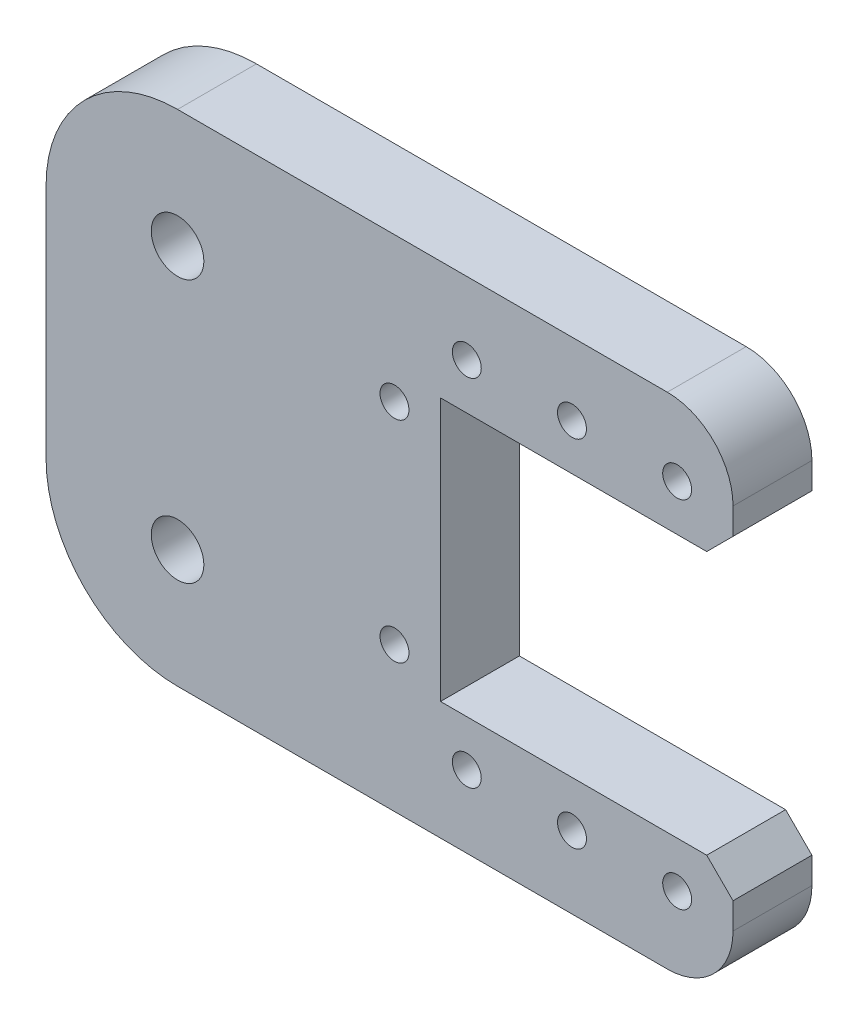
ISO-10303-21;
HEADER;
FILE_DESCRIPTION(('STEP AP214'),'2;1');
FILE_NAME('part.step','',(''),(''),'','','');
FILE_SCHEMA(('AUTOMOTIVE_DESIGN { 1 0 10303 214 1 1 1 1 }'));
ENDSEC;
DATA;
#1=APPLICATION_CONTEXT('core data for automotive mechanical design processes');
#2=APPLICATION_PROTOCOL_DEFINITION('international standard','automotive_design',2000,#1);
#3=PRODUCT_CONTEXT('',#1,'mechanical');
#4=PRODUCT('Part','Part','',(#3));
#5=PRODUCT_RELATED_PRODUCT_CATEGORY('part','',(#4));
#6=PRODUCT_DEFINITION_FORMATION('','',#4);
#7=PRODUCT_DEFINITION_CONTEXT('part definition',#1,'design');
#8=PRODUCT_DEFINITION('design','',#6,#7);
#9=PRODUCT_DEFINITION_SHAPE('','',#8);
#10=(LENGTH_UNIT() NAMED_UNIT(*) SI_UNIT(.MILLI.,.METRE.));
#11=(NAMED_UNIT(*) PLANE_ANGLE_UNIT() SI_UNIT($,.RADIAN.));
#12=(NAMED_UNIT(*) SI_UNIT($,.STERADIAN.) SOLID_ANGLE_UNIT());
#13=UNCERTAINTY_MEASURE_WITH_UNIT(LENGTH_MEASURE(1.E-05),#10,'distance_accuracy_value','');
#14=(GEOMETRIC_REPRESENTATION_CONTEXT(3) GLOBAL_UNCERTAINTY_ASSIGNED_CONTEXT((#13)) GLOBAL_UNIT_ASSIGNED_CONTEXT((#10,
#11,#12)) REPRESENTATION_CONTEXT('',''));
#15=CARTESIAN_POINT('',(0.,0.,0.));
#16=DIRECTION('',(0.,0.,1.));
#17=DIRECTION('',(1.,0.,0.));
#18=AXIS2_PLACEMENT_3D('',#15,#16,#17);
#19=CARTESIAN_POINT('',(0.,0.,6.));
#20=DIRECTION('',(0.,0.,1.));
#21=DIRECTION('',(1.,0.,0.));
#22=AXIS2_PLACEMENT_3D('',#19,#20,#21);
#23=PLANE('',#22);
#24=CARTESIAN_POINT('',(11.9181455910028,-23.3165283540876,6.));
#25=DIRECTION('',(0.,0.,1.));
#26=DIRECTION('',(1.,0.,0.));
#27=AXIS2_PLACEMENT_3D('',#24,#25,#26);
#28=CIRCLE('',#27,1.10000000000211);
#29=CARTESIAN_POINT('',(13.018145591005,-23.3165283540876,6.));
#30=VERTEX_POINT('',#29);
#31=EDGE_CURVE('E507',#30,#30,#28,.T.);
#32=ORIENTED_EDGE('',*,*,#31,.F.);
#33=EDGE_LOOP('',(#32));
#34=FACE_BOUND('',#33,.T.);
#35=CARTESIAN_POINT('',(3.91814559100285,-23.3165283540876,6.));
#36=DIRECTION('',(0.,0.,1.));
#37=DIRECTION('',(1.,0.,0.));
#38=AXIS2_PLACEMENT_3D('',#35,#36,#37);
#39=CIRCLE('',#38,1.1000000000047);
#40=CARTESIAN_POINT('',(5.01814559100755,-23.3165283540876,6.));
#41=VERTEX_POINT('',#40);
#42=EDGE_CURVE('E501',#41,#41,#39,.T.);
#43=ORIENTED_EDGE('',*,*,#42,.F.);
#44=EDGE_LOOP('',(#43));
#45=FACE_BOUND('',#44,.T.);
#46=CARTESIAN_POINT('',(-4.08185440899716,-23.3165283540875,6.));
#47=DIRECTION('',(0.,0.,1.));
#48=DIRECTION('',(1.,0.,0.));
#49=AXIS2_PLACEMENT_3D('',#46,#47,#48);
#50=CIRCLE('',#49,1.1000000000047);
#51=CARTESIAN_POINT('',(-2.98185440899245,-23.3165283540875,6.));
#52=VERTEX_POINT('',#51);
#53=EDGE_CURVE('E495',#52,#52,#50,.T.);
#54=ORIENTED_EDGE('',*,*,#53,.F.);
#55=EDGE_LOOP('',(#54));
#56=FACE_BOUND('',#55,.T.);
#57=CARTESIAN_POINT('',(-9.58185440899689,-17.8165283540763,6.));
#58=DIRECTION('',(0.,0.,1.));
#59=DIRECTION('',(1.,0.,0.));
#60=AXIS2_PLACEMENT_3D('',#57,#58,#59);
#61=CIRCLE('',#60,1.09999999999961);
#62=CARTESIAN_POINT('',(-8.48185440899728,-17.8165283540763,6.));
#63=VERTEX_POINT('',#62);
#64=EDGE_CURVE('E489',#63,#63,#61,.T.);
#65=ORIENTED_EDGE('',*,*,#64,.F.);
#66=EDGE_LOOP('',(#65));
#67=FACE_BOUND('',#66,.T.);
#68=CARTESIAN_POINT('',(-9.58185440899688,-1.81652835408409,6.));
#69=DIRECTION('',(0.,0.,1.));
#70=DIRECTION('',(1.,0.,0.));
#71=AXIS2_PLACEMENT_3D('',#68,#69,#70);
#72=CIRCLE('',#71,1.09999999999961);
#73=CARTESIAN_POINT('',(-8.48185440899727,-1.81652835408409,6.));
#74=VERTEX_POINT('',#73);
#75=EDGE_CURVE('E483',#74,#74,#72,.T.);
#76=ORIENTED_EDGE('',*,*,#75,.F.);
#77=EDGE_LOOP('',(#76));
#78=FACE_BOUND('',#77,.T.);
#79=CARTESIAN_POINT('',(11.9181455910028,3.68347164592715,6.));
#80=DIRECTION('',(0.,0.,1.));
#81=DIRECTION('',(1.,0.,0.));
#82=AXIS2_PLACEMENT_3D('',#79,#80,#81);
#83=CIRCLE('',#82,1.1000000000047);
#84=CARTESIAN_POINT('',(13.0181455910075,3.68347164592715,6.));
#85=VERTEX_POINT('',#84);
#86=EDGE_CURVE('E477',#85,#85,#83,.T.);
#87=ORIENTED_EDGE('',*,*,#86,.F.);
#88=EDGE_LOOP('',(#87));
#89=FACE_BOUND('',#88,.T.);
#90=CARTESIAN_POINT('',(3.91814559100278,3.68347164592722,6.));
#91=DIRECTION('',(0.,0.,1.));
#92=DIRECTION('',(1.,0.,0.));
#93=AXIS2_PLACEMENT_3D('',#90,#91,#92);
#94=CIRCLE('',#93,1.10000000000475);
#95=CARTESIAN_POINT('',(5.01814559100752,3.68347164592722,6.));
#96=VERTEX_POINT('',#95);
#97=EDGE_CURVE('E471',#96,#96,#94,.T.);
#98=ORIENTED_EDGE('',*,*,#97,.F.);
#99=EDGE_LOOP('',(#98));
#100=FACE_BOUND('',#99,.T.);
#101=CARTESIAN_POINT('',(-4.08185440899722,3.68347164592721,6.));
#102=DIRECTION('',(0.,0.,1.));
#103=DIRECTION('',(1.,0.,0.));
#104=AXIS2_PLACEMENT_3D('',#101,#102,#103);
#105=CIRCLE('',#104,1.10000000000216);
#106=CARTESIAN_POINT('',(-2.98185440899506,3.68347164592721,6.));
#107=VERTEX_POINT('',#106);
#108=EDGE_CURVE('E458',#107,#107,#105,.T.);
#109=ORIENTED_EDGE('',*,*,#108,.F.);
#110=EDGE_LOOP('',(#109));
#111=FACE_BOUND('',#110,.T.);
#112=CARTESIAN_POINT('',(-26.0818544089971,0.18347164591978,6.));
#113=DIRECTION('',(0.,0.,1.));
#114=DIRECTION('',(1.,0.,0.));
#115=AXIS2_PLACEMENT_3D('',#112,#113,#114);
#116=CIRCLE('',#115,2.);
#117=CARTESIAN_POINT('',(-24.0818544089971,0.18347164591978,6.));
#118=VERTEX_POINT('',#117);
#119=EDGE_CURVE('E168',#118,#118,#116,.T.);
#120=ORIENTED_EDGE('',*,*,#119,.F.);
#121=EDGE_LOOP('',(#120));
#122=FACE_BOUND('',#121,.T.);
#123=DIRECTION('',(0.,1.,0.));
#124=VECTOR('',#123,1.);
#125=CARTESIAN_POINT('',(16.1681455910029,-28.8165283540802,6.));
#126=LINE('',#125,#124);
#127=CARTESIAN_POINT('',(16.1681455910029,-23.8165283540802,6.));
#128=VERTEX_POINT('',#127);
#129=CARTESIAN_POINT('',(16.1681455910029,-21.8165283540802,6.));
#130=VERTEX_POINT('',#129);
#131=EDGE_CURVE('E144',#128,#130,#126,.T.);
#132=ORIENTED_EDGE('',*,*,#131,.T.);
#133=DIRECTION('',(0.707106781186546,-0.707106781186549,0.));
#134=VECTOR('',#133,1.);
#135=CARTESIAN_POINT('',(-2.82419138153864,-2.82419138153863,6.));
#136=LINE('',#135,#134);
#137=CARTESIAN_POINT('',(14.1681455910029,-19.8165283540802,6.));
#138=VERTEX_POINT('',#137);
#139=EDGE_CURVE('E140',#130,#138,#136,.F.);
#140=ORIENTED_EDGE('',*,*,#139,.T.);
#141=DIRECTION('',(-1.,0.,0.));
#142=VECTOR('',#141,1.);
#143=CARTESIAN_POINT('',(16.1681455910029,-19.8165283540802,6.));
#144=LINE('',#143,#142);
#145=CARTESIAN_POINT('',(-6.08185440899712,-19.8165283540802,6.));
#146=VERTEX_POINT('',#145);
#147=EDGE_CURVE('E132',#138,#146,#144,.T.);
#148=ORIENTED_EDGE('',*,*,#147,.T.);
#149=DIRECTION('',(0.,1.,0.));
#150=VECTOR('',#149,1.);
#151=CARTESIAN_POINT('',(-6.08185440899712,-19.8165283540802,6.));
#152=LINE('',#151,#150);
#153=CARTESIAN_POINT('',(-6.08185440899712,0.18347164591978,6.));
#154=VERTEX_POINT('',#153);
#155=EDGE_CURVE('E137',#146,#154,#152,.T.);
#156=ORIENTED_EDGE('',*,*,#155,.T.);
#157=DIRECTION('',(1.,0.,0.));
#158=VECTOR('',#157,1.);
#159=CARTESIAN_POINT('',(-6.08185440899712,0.18347164591978,6.));
#160=LINE('',#159,#158);
#161=CARTESIAN_POINT('',(14.1681455910029,0.18347164591978,6.));
#162=VERTEX_POINT('',#161);
#163=EDGE_CURVE('E158',#154,#162,#160,.T.);
#164=ORIENTED_EDGE('',*,*,#163,.T.);
#165=DIRECTION('',(-0.707106781186549,-0.707106781186546,0.));
#166=VECTOR('',#165,1.);
#167=CARTESIAN_POINT('',(6.99233697254152,-6.99233697254155,6.));
#168=LINE('',#167,#166);
#169=CARTESIAN_POINT('',(16.1681455910029,2.18347164591977,6.));
#170=VERTEX_POINT('',#169);
#171=EDGE_CURVE('E48',#162,#170,#168,.F.);
#172=ORIENTED_EDGE('',*,*,#171,.T.);
#173=DIRECTION('',(0.,1.,0.));
#174=VECTOR('',#173,1.);
#175=CARTESIAN_POINT('',(16.1681455910029,0.18347164591978,6.));
#176=LINE('',#175,#174);
#177=CARTESIAN_POINT('',(16.1681455910029,4.18347164591978,6.));
#178=VERTEX_POINT('',#177);
#179=EDGE_CURVE('E160',#170,#178,#176,.T.);
#180=ORIENTED_EDGE('',*,*,#179,.T.);
#181=CARTESIAN_POINT('',(11.1681455910029,4.18347164591978,6.));
#182=DIRECTION('',(0.,0.,1.));
#183=DIRECTION('',(1.,0.,0.));
#184=AXIS2_PLACEMENT_3D('',#181,#182,#183);
#185=CIRCLE('',#184,5.);
#186=CARTESIAN_POINT('',(11.1681455910029,9.18347164591978,6.));
#187=VERTEX_POINT('',#186);
#188=EDGE_CURVE('E215',#178,#187,#185,.T.);
#189=ORIENTED_EDGE('',*,*,#188,.T.);
#190=DIRECTION('',(-1.,0.,0.));
#191=VECTOR('',#190,1.);
#192=CARTESIAN_POINT('',(16.1681455910029,9.18347164591978,6.));
#193=LINE('',#192,#191);
#194=CARTESIAN_POINT('',(-26.0818544089971,9.18347164591978,6.));
#195=VERTEX_POINT('',#194);
#196=EDGE_CURVE('E184',#187,#195,#193,.T.);
#197=ORIENTED_EDGE('',*,*,#196,.T.);
#198=CARTESIAN_POINT('',(-26.0818544089971,-0.816528354080226,6.));
#199=DIRECTION('',(0.,0.,1.));
#200=DIRECTION('',(1.,0.,0.));
#201=AXIS2_PLACEMENT_3D('',#198,#199,#200);
#202=CIRCLE('',#201,10.);
#203=CARTESIAN_POINT('',(-36.0818544089971,-0.816528354080227,6.));
#204=VERTEX_POINT('',#203);
#205=EDGE_CURVE('E198',#195,#204,#202,.T.);
#206=ORIENTED_EDGE('',*,*,#205,.T.);
#207=DIRECTION('',(0.,-1.,0.));
#208=VECTOR('',#207,1.);
#209=CARTESIAN_POINT('',(-36.0818544089971,9.18347164591977,6.));
#210=LINE('',#209,#208);
#211=CARTESIAN_POINT('',(-36.0818544089971,-18.8165283540802,6.));
#212=VERTEX_POINT('',#211);
#213=EDGE_CURVE('E255',#204,#212,#210,.T.);
#214=ORIENTED_EDGE('',*,*,#213,.T.);
#215=CARTESIAN_POINT('',(-26.0818544089971,-18.8165283540802,6.));
#216=DIRECTION('',(0.,0.,1.));
#217=DIRECTION('',(1.,0.,0.));
#218=AXIS2_PLACEMENT_3D('',#215,#216,#217);
#219=CIRCLE('',#218,10.);
#220=CARTESIAN_POINT('',(-26.0818544089971,-28.8165283540802,6.));
#221=VERTEX_POINT('',#220);
#222=EDGE_CURVE('E200',#212,#221,#219,.T.);
#223=ORIENTED_EDGE('',*,*,#222,.T.);
#224=DIRECTION('',(1.,0.,0.));
#225=VECTOR('',#224,1.);
#226=CARTESIAN_POINT('',(-36.0818544089971,-28.8165283540802,6.));
#227=LINE('',#226,#225);
#228=CARTESIAN_POINT('',(11.1681455910029,-28.8165283540802,6.));
#229=VERTEX_POINT('',#228);
#230=EDGE_CURVE('E258',#221,#229,#227,.T.);
#231=ORIENTED_EDGE('',*,*,#230,.T.);
#232=CARTESIAN_POINT('',(11.1681455910029,-23.8165283540802,6.));
#233=DIRECTION('',(0.,0.,1.));
#234=DIRECTION('',(1.,0.,0.));
#235=AXIS2_PLACEMENT_3D('',#232,#233,#234);
#236=CIRCLE('',#235,5.);
#237=EDGE_CURVE('E217',#229,#128,#236,.T.);
#238=ORIENTED_EDGE('',*,*,#237,.T.);
#239=EDGE_LOOP('',(#132,#140,#148,#156,#164,#172,#180,#189,#197,#206,#214,#223,#231,#238));
#240=FACE_BOUND('',#239,.T.);
#241=CARTESIAN_POINT('',(-26.0818544089971,-19.8165283540802,6.));
#242=DIRECTION('',(0.,0.,1.));
#243=DIRECTION('',(1.,0.,0.));
#244=AXIS2_PLACEMENT_3D('',#241,#242,#243);
#245=CIRCLE('',#244,2.);
#246=CARTESIAN_POINT('',(-24.0818544089971,-19.8165283540802,6.));
#247=VERTEX_POINT('',#246);
#248=EDGE_CURVE('E450',#247,#247,#245,.T.);
#249=ORIENTED_EDGE('',*,*,#248,.F.);
#250=EDGE_LOOP('',(#249));
#251=FACE_BOUND('',#250,.T.);
#252=ADVANCED_FACE('F33',(#34,#45,#56,#67,#78,#89,#100,#111,#122,#240,#251),#23,.T.);
#253=CARTESIAN_POINT('',(0.,0.,0.));
#254=DIRECTION('',(0.,0.,1.));
#255=DIRECTION('',(1.,0.,0.));
#256=AXIS2_PLACEMENT_3D('',#253,#254,#255);
#257=PLANE('',#256);
#258=CARTESIAN_POINT('',(11.9181455910028,-23.3165283540876,0.));
#259=DIRECTION('',(0.,0.,1.));
#260=DIRECTION('',(1.,0.,0.));
#261=AXIS2_PLACEMENT_3D('',#258,#259,#260);
#262=CIRCLE('',#261,1.10000000000211);
#263=CARTESIAN_POINT('',(13.018145591005,-23.3165283540876,0.));
#264=VERTEX_POINT('',#263);
#265=EDGE_CURVE('E504',#264,#264,#262,.T.);
#266=ORIENTED_EDGE('',*,*,#265,.T.);
#267=EDGE_LOOP('',(#266));
#268=FACE_BOUND('',#267,.T.);
#269=CARTESIAN_POINT('',(3.91814559100285,-23.3165283540876,0.));
#270=DIRECTION('',(0.,0.,1.));
#271=DIRECTION('',(1.,0.,0.));
#272=AXIS2_PLACEMENT_3D('',#269,#270,#271);
#273=CIRCLE('',#272,1.1000000000047);
#274=CARTESIAN_POINT('',(5.01814559100755,-23.3165283540876,0.));
#275=VERTEX_POINT('',#274);
#276=EDGE_CURVE('E498',#275,#275,#273,.T.);
#277=ORIENTED_EDGE('',*,*,#276,.T.);
#278=EDGE_LOOP('',(#277));
#279=FACE_BOUND('',#278,.T.);
#280=CARTESIAN_POINT('',(-4.08185440899716,-23.3165283540875,0.));
#281=DIRECTION('',(0.,0.,1.));
#282=DIRECTION('',(1.,0.,0.));
#283=AXIS2_PLACEMENT_3D('',#280,#281,#282);
#284=CIRCLE('',#283,1.1000000000047);
#285=CARTESIAN_POINT('',(-2.98185440899245,-23.3165283540875,0.));
#286=VERTEX_POINT('',#285);
#287=EDGE_CURVE('E492',#286,#286,#284,.T.);
#288=ORIENTED_EDGE('',*,*,#287,.T.);
#289=EDGE_LOOP('',(#288));
#290=FACE_BOUND('',#289,.T.);
#291=CARTESIAN_POINT('',(-9.58185440899689,-17.8165283540763,0.));
#292=DIRECTION('',(0.,0.,1.));
#293=DIRECTION('',(1.,0.,0.));
#294=AXIS2_PLACEMENT_3D('',#291,#292,#293);
#295=CIRCLE('',#294,1.09999999999961);
#296=CARTESIAN_POINT('',(-8.48185440899728,-17.8165283540763,0.));
#297=VERTEX_POINT('',#296);
#298=EDGE_CURVE('E486',#297,#297,#295,.T.);
#299=ORIENTED_EDGE('',*,*,#298,.T.);
#300=EDGE_LOOP('',(#299));
#301=FACE_BOUND('',#300,.T.);
#302=CARTESIAN_POINT('',(-9.58185440899688,-1.81652835408409,0.));
#303=DIRECTION('',(0.,0.,1.));
#304=DIRECTION('',(1.,0.,0.));
#305=AXIS2_PLACEMENT_3D('',#302,#303,#304);
#306=CIRCLE('',#305,1.09999999999961);
#307=CARTESIAN_POINT('',(-8.48185440899727,-1.81652835408409,0.));
#308=VERTEX_POINT('',#307);
#309=EDGE_CURVE('E480',#308,#308,#306,.T.);
#310=ORIENTED_EDGE('',*,*,#309,.T.);
#311=EDGE_LOOP('',(#310));
#312=FACE_BOUND('',#311,.T.);
#313=CARTESIAN_POINT('',(11.9181455910028,3.68347164592715,0.));
#314=DIRECTION('',(0.,0.,1.));
#315=DIRECTION('',(1.,0.,0.));
#316=AXIS2_PLACEMENT_3D('',#313,#314,#315);
#317=CIRCLE('',#316,1.1000000000047);
#318=CARTESIAN_POINT('',(13.0181455910075,3.68347164592715,0.));
#319=VERTEX_POINT('',#318);
#320=EDGE_CURVE('E474',#319,#319,#317,.T.);
#321=ORIENTED_EDGE('',*,*,#320,.T.);
#322=EDGE_LOOP('',(#321));
#323=FACE_BOUND('',#322,.T.);
#324=CARTESIAN_POINT('',(3.91814559100278,3.68347164592722,0.));
#325=DIRECTION('',(0.,0.,1.));
#326=DIRECTION('',(1.,0.,0.));
#327=AXIS2_PLACEMENT_3D('',#324,#325,#326);
#328=CIRCLE('',#327,1.10000000000475);
#329=CARTESIAN_POINT('',(5.01814559100752,3.68347164592722,0.));
#330=VERTEX_POINT('',#329);
#331=EDGE_CURVE('E469',#330,#330,#328,.T.);
#332=ORIENTED_EDGE('',*,*,#331,.T.);
#333=EDGE_LOOP('',(#332));
#334=FACE_BOUND('',#333,.T.);
#335=CARTESIAN_POINT('',(-4.08185440899722,3.68347164592721,0.));
#336=DIRECTION('',(0.,0.,1.));
#337=DIRECTION('',(1.,0.,0.));
#338=AXIS2_PLACEMENT_3D('',#335,#336,#337);
#339=CIRCLE('',#338,1.10000000000216);
#340=CARTESIAN_POINT('',(-2.98185440899506,3.68347164592721,0.));
#341=VERTEX_POINT('',#340);
#342=EDGE_CURVE('E454',#341,#341,#339,.T.);
#343=ORIENTED_EDGE('',*,*,#342,.T.);
#344=EDGE_LOOP('',(#343));
#345=FACE_BOUND('',#344,.T.);
#346=CARTESIAN_POINT('',(-26.0818544089971,0.18347164591978,0.));
#347=DIRECTION('',(0.,0.,1.));
#348=DIRECTION('',(1.,0.,0.));
#349=AXIS2_PLACEMENT_3D('',#346,#347,#348);
#350=CIRCLE('',#349,2.);
#351=CARTESIAN_POINT('',(-24.0818544089971,0.18347164591978,0.));
#352=VERTEX_POINT('',#351);
#353=EDGE_CURVE('E261',#352,#352,#350,.T.);
#354=ORIENTED_EDGE('',*,*,#353,.T.);
#355=EDGE_LOOP('',(#354));
#356=FACE_BOUND('',#355,.T.);
#357=DIRECTION('',(-1.,0.,0.));
#358=VECTOR('',#357,1.);
#359=CARTESIAN_POINT('',(16.1681455910029,-19.8165283540802,0.));
#360=LINE('',#359,#358);
#361=CARTESIAN_POINT('',(14.1681455910029,-19.8165283540802,0.));
#362=VERTEX_POINT('',#361);
#363=CARTESIAN_POINT('',(-6.08185440899712,-19.8165283540802,0.));
#364=VERTEX_POINT('',#363);
#365=EDGE_CURVE('E150',#362,#364,#360,.T.);
#366=ORIENTED_EDGE('',*,*,#365,.F.);
#367=DIRECTION('',(-0.707106781186546,0.707106781186549,0.));
#368=VECTOR('',#367,1.);
#369=CARTESIAN_POINT('',(14.1681455910029,-19.8165283540802,0.));
#370=LINE('',#369,#368);
#371=CARTESIAN_POINT('',(16.1681455910029,-21.8165283540802,0.));
#372=VERTEX_POINT('',#371);
#373=EDGE_CURVE('E229',#362,#372,#370,.F.);
#374=ORIENTED_EDGE('',*,*,#373,.T.);
#375=DIRECTION('',(0.,1.,0.));
#376=VECTOR('',#375,1.);
#377=CARTESIAN_POINT('',(16.1681455910029,-28.8165283540802,0.));
#378=LINE('',#377,#376);
#379=CARTESIAN_POINT('',(16.1681455910029,-23.8165283540802,0.));
#380=VERTEX_POINT('',#379);
#381=EDGE_CURVE('E174',#380,#372,#378,.T.);
#382=ORIENTED_EDGE('',*,*,#381,.F.);
#383=CARTESIAN_POINT('',(11.1681455910029,-23.8165283540802,0.));
#384=DIRECTION('',(0.,0.,1.));
#385=DIRECTION('',(1.,0.,0.));
#386=AXIS2_PLACEMENT_3D('',#383,#384,#385);
#387=CIRCLE('',#386,5.);
#388=CARTESIAN_POINT('',(11.1681455910029,-28.8165283540802,0.));
#389=VERTEX_POINT('',#388);
#390=EDGE_CURVE('E211',#380,#389,#387,.F.);
#391=ORIENTED_EDGE('',*,*,#390,.T.);
#392=DIRECTION('',(1.,0.,0.));
#393=VECTOR('',#392,1.);
#394=CARTESIAN_POINT('',(-36.0818544089971,-28.8165283540802,0.));
#395=LINE('',#394,#393);
#396=CARTESIAN_POINT('',(-26.0818544089971,-28.8165283540802,0.));
#397=VERTEX_POINT('',#396);
#398=EDGE_CURVE('E171',#397,#389,#395,.T.);
#399=ORIENTED_EDGE('',*,*,#398,.F.);
#400=CARTESIAN_POINT('',(-26.0818544089971,-18.8165283540802,0.));
#401=DIRECTION('',(0.,0.,1.));
#402=DIRECTION('',(1.,0.,0.));
#403=AXIS2_PLACEMENT_3D('',#400,#401,#402);
#404=CIRCLE('',#403,10.);
#405=CARTESIAN_POINT('',(-36.0818544089971,-18.8165283540802,0.));
#406=VERTEX_POINT('',#405);
#407=EDGE_CURVE('E191',#397,#406,#404,.F.);
#408=ORIENTED_EDGE('',*,*,#407,.T.);
#409=DIRECTION('',(0.,-1.,0.));
#410=VECTOR('',#409,1.);
#411=CARTESIAN_POINT('',(-36.0818544089971,9.18347164591977,0.));
#412=LINE('',#411,#410);
#413=CARTESIAN_POINT('',(-36.0818544089971,-0.816528354080227,0.));
#414=VERTEX_POINT('',#413);
#415=EDGE_CURVE('E167',#414,#406,#412,.T.);
#416=ORIENTED_EDGE('',*,*,#415,.F.);
#417=CARTESIAN_POINT('',(-26.0818544089971,-0.816528354080226,0.));
#418=DIRECTION('',(0.,0.,1.));
#419=DIRECTION('',(1.,0.,0.));
#420=AXIS2_PLACEMENT_3D('',#417,#418,#419);
#421=CIRCLE('',#420,10.);
#422=CARTESIAN_POINT('',(-26.0818544089971,9.18347164591978,0.));
#423=VERTEX_POINT('',#422);
#424=EDGE_CURVE('E188',#414,#423,#421,.F.);
#425=ORIENTED_EDGE('',*,*,#424,.T.);
#426=DIRECTION('',(-1.,0.,0.));
#427=VECTOR('',#426,1.);
#428=CARTESIAN_POINT('',(16.1681455910029,9.18347164591978,0.));
#429=LINE('',#428,#427);
#430=CARTESIAN_POINT('',(11.1681455910029,9.18347164591978,0.));
#431=VERTEX_POINT('',#430);
#432=EDGE_CURVE('E165',#431,#423,#429,.T.);
#433=ORIENTED_EDGE('',*,*,#432,.F.);
#434=CARTESIAN_POINT('',(11.1681455910029,4.18347164591978,0.));
#435=DIRECTION('',(0.,0.,1.));
#436=DIRECTION('',(1.,0.,0.));
#437=AXIS2_PLACEMENT_3D('',#434,#435,#436);
#438=CIRCLE('',#437,5.);
#439=CARTESIAN_POINT('',(16.1681455910029,4.18347164591978,0.));
#440=VERTEX_POINT('',#439);
#441=EDGE_CURVE('E208',#431,#440,#438,.F.);
#442=ORIENTED_EDGE('',*,*,#441,.T.);
#443=DIRECTION('',(0.,1.,0.));
#444=VECTOR('',#443,1.);
#445=CARTESIAN_POINT('',(16.1681455910029,0.18347164591978,0.));
#446=LINE('',#445,#444);
#447=CARTESIAN_POINT('',(16.1681455910029,2.18347164591978,0.));
#448=VERTEX_POINT('',#447);
#449=EDGE_CURVE('E182',#448,#440,#446,.T.);
#450=ORIENTED_EDGE('',*,*,#449,.F.);
#451=DIRECTION('',(0.707106781186549,0.707106781186546,0.));
#452=VECTOR('',#451,1.);
#453=CARTESIAN_POINT('',(16.1681455910029,2.18347164591978,0.));
#454=LINE('',#453,#452);
#455=CARTESIAN_POINT('',(14.1681455910029,0.18347164591978,0.));
#456=VERTEX_POINT('',#455);
#457=EDGE_CURVE('E227',#448,#456,#454,.F.);
#458=ORIENTED_EDGE('',*,*,#457,.T.);
#459=DIRECTION('',(1.,0.,0.));
#460=VECTOR('',#459,1.);
#461=CARTESIAN_POINT('',(-6.08185440899712,0.18347164591978,0.));
#462=LINE('',#461,#460);
#463=CARTESIAN_POINT('',(-6.08185440899712,0.18347164591978,0.));
#464=VERTEX_POINT('',#463);
#465=EDGE_CURVE('E180',#464,#456,#462,.T.);
#466=ORIENTED_EDGE('',*,*,#465,.F.);
#467=DIRECTION('',(0.,1.,0.));
#468=VECTOR('',#467,1.);
#469=CARTESIAN_POINT('',(-6.08185440899712,-19.8165283540802,0.));
#470=LINE('',#469,#468);
#471=EDGE_CURVE('E178',#364,#464,#470,.T.);
#472=ORIENTED_EDGE('',*,*,#471,.F.);
#473=EDGE_LOOP('',(#366,#374,#382,#391,#399,#408,#416,#425,#433,#442,#450,#458,#466,#472));
#474=FACE_BOUND('',#473,.T.);
#475=CARTESIAN_POINT('',(-26.0818544089971,-19.8165283540802,0.));
#476=DIRECTION('',(0.,0.,1.));
#477=DIRECTION('',(1.,0.,0.));
#478=AXIS2_PLACEMENT_3D('',#475,#476,#477);
#479=CIRCLE('',#478,2.);
#480=CARTESIAN_POINT('',(-24.0818544089971,-19.8165283540802,0.));
#481=VERTEX_POINT('',#480);
#482=EDGE_CURVE('E453',#481,#481,#479,.T.);
#483=ORIENTED_EDGE('',*,*,#482,.T.);
#484=EDGE_LOOP('',(#483));
#485=FACE_BOUND('',#484,.T.);
#486=ADVANCED_FACE('F241',(#268,#279,#290,#301,#312,#323,#334,#345,#356,#474,#485),#257,.F.);
#487=CARTESIAN_POINT('',(16.1681455910029,9.18347164591978,6.));
#488=DIRECTION('',(0.,-1.,0.));
#489=DIRECTION('',(1.,0.,0.));
#490=AXIS2_PLACEMENT_3D('',#487,#488,#489);
#491=PLANE('',#490);
#492=ORIENTED_EDGE('',*,*,#196,.F.);
#493=DIRECTION('',(0.,0.,-1.));
#494=VECTOR('',#493,1.);
#495=CARTESIAN_POINT('',(11.1681455910029,9.18347164591978,6.));
#496=LINE('',#495,#494);
#497=EDGE_CURVE('E219',#187,#431,#496,.T.);
#498=ORIENTED_EDGE('',*,*,#497,.T.);
#499=ORIENTED_EDGE('',*,*,#432,.T.);
#500=DIRECTION('',(0.,0.,-1.));
#501=VECTOR('',#500,1.);
#502=CARTESIAN_POINT('',(-26.0818544089971,9.18347164591978,6.));
#503=LINE('',#502,#501);
#504=EDGE_CURVE('E202',#423,#195,#503,.F.);
#505=ORIENTED_EDGE('',*,*,#504,.T.);
#506=EDGE_LOOP('',(#492,#498,#499,#505));
#507=FACE_BOUND('',#506,.T.);
#508=ADVANCED_FACE('F252',(#507),#491,.F.);
#509=CARTESIAN_POINT('',(-36.0818544089971,9.18347164591977,6.));
#510=DIRECTION('',(1.,0.,0.));
#511=DIRECTION('',(0.,1.,0.));
#512=AXIS2_PLACEMENT_3D('',#509,#510,#511);
#513=PLANE('',#512);
#514=ORIENTED_EDGE('',*,*,#415,.T.);
#515=DIRECTION('',(0.,0.,-1.));
#516=VECTOR('',#515,1.);
#517=CARTESIAN_POINT('',(-36.0818544089971,-18.8165283540802,6.));
#518=LINE('',#517,#516);
#519=EDGE_CURVE('E196',#406,#212,#518,.F.);
#520=ORIENTED_EDGE('',*,*,#519,.T.);
#521=ORIENTED_EDGE('',*,*,#213,.F.);
#522=DIRECTION('',(0.,0.,-1.));
#523=VECTOR('',#522,1.);
#524=CARTESIAN_POINT('',(-36.0818544089971,-0.816528354080227,6.));
#525=LINE('',#524,#523);
#526=EDGE_CURVE('E193',#204,#414,#525,.T.);
#527=ORIENTED_EDGE('',*,*,#526,.T.);
#528=EDGE_LOOP('',(#514,#520,#521,#527));
#529=FACE_BOUND('',#528,.T.);
#530=ADVANCED_FACE('F311',(#529),#513,.F.);
#531=CARTESIAN_POINT('',(-36.0818544089971,-28.8165283540802,6.));
#532=DIRECTION('',(0.,1.,0.));
#533=DIRECTION('',(0.,0.,1.));
#534=AXIS2_PLACEMENT_3D('',#531,#532,#533);
#535=PLANE('',#534);
#536=ORIENTED_EDGE('',*,*,#398,.T.);
#537=DIRECTION('',(0.,0.,-1.));
#538=VECTOR('',#537,1.);
#539=CARTESIAN_POINT('',(11.1681455910029,-28.8165283540802,6.));
#540=LINE('',#539,#538);
#541=EDGE_CURVE('E213',#389,#229,#540,.F.);
#542=ORIENTED_EDGE('',*,*,#541,.T.);
#543=ORIENTED_EDGE('',*,*,#230,.F.);
#544=DIRECTION('',(0.,0.,-1.));
#545=VECTOR('',#544,1.);
#546=CARTESIAN_POINT('',(-26.0818544089971,-28.8165283540802,6.));
#547=LINE('',#546,#545);
#548=EDGE_CURVE('E153',#221,#397,#547,.T.);
#549=ORIENTED_EDGE('',*,*,#548,.T.);
#550=EDGE_LOOP('',(#536,#542,#543,#549));
#551=FACE_BOUND('',#550,.T.);
#552=ADVANCED_FACE('F308',(#551),#535,.F.);
#553=CARTESIAN_POINT('',(16.1681455910029,-28.8165283540802,6.));
#554=DIRECTION('',(-1.,0.,0.));
#555=DIRECTION('',(0.,0.,1.));
#556=AXIS2_PLACEMENT_3D('',#553,#554,#555);
#557=PLANE('',#556);
#558=ORIENTED_EDGE('',*,*,#381,.T.);
#559=DIRECTION('',(0.,0.,1.));
#560=VECTOR('',#559,1.);
#561=CARTESIAN_POINT('',(16.1681455910029,-21.8165283540802,6.));
#562=LINE('',#561,#560);
#563=EDGE_CURVE('E231',#372,#130,#562,.T.);
#564=ORIENTED_EDGE('',*,*,#563,.T.);
#565=ORIENTED_EDGE('',*,*,#131,.F.);
#566=DIRECTION('',(0.,0.,-1.));
#567=VECTOR('',#566,1.);
#568=CARTESIAN_POINT('',(16.1681455910029,-23.8165283540802,6.));
#569=LINE('',#568,#567);
#570=EDGE_CURVE('E205',#128,#380,#569,.T.);
#571=ORIENTED_EDGE('',*,*,#570,.T.);
#572=EDGE_LOOP('',(#558,#564,#565,#571));
#573=FACE_BOUND('',#572,.T.);
#574=ADVANCED_FACE('F305',(#573),#557,.F.);
#575=CARTESIAN_POINT('',(16.1681455910029,-19.8165283540802,6.));
#576=DIRECTION('',(0.,-1.,0.));
#577=DIRECTION('',(1.,0.,0.));
#578=AXIS2_PLACEMENT_3D('',#575,#576,#577);
#579=PLANE('',#578);
#580=ORIENTED_EDGE('',*,*,#147,.F.);
#581=DIRECTION('',(0.,0.,-1.));
#582=VECTOR('',#581,1.);
#583=CARTESIAN_POINT('',(14.1681455910029,-19.8165283540802,6.));
#584=LINE('',#583,#582);
#585=EDGE_CURVE('E225',#138,#362,#584,.T.);
#586=ORIENTED_EDGE('',*,*,#585,.T.);
#587=ORIENTED_EDGE('',*,*,#365,.T.);
#588=DIRECTION('',(0.,0.,-1.));
#589=VECTOR('',#588,1.);
#590=CARTESIAN_POINT('',(-6.08185440899712,-19.8165283540802,6.));
#591=LINE('',#590,#589);
#592=EDGE_CURVE('E147',#146,#364,#591,.T.);
#593=ORIENTED_EDGE('',*,*,#592,.F.);
#594=EDGE_LOOP('',(#580,#586,#587,#593));
#595=FACE_BOUND('',#594,.T.);
#596=ADVANCED_FACE('F148',(#595),#579,.F.);
#597=CARTESIAN_POINT('',(-6.08185440899712,-19.8165283540802,6.));
#598=DIRECTION('',(-1.,0.,0.));
#599=DIRECTION('',(0.,0.,1.));
#600=AXIS2_PLACEMENT_3D('',#597,#598,#599);
#601=PLANE('',#600);
#602=ORIENTED_EDGE('',*,*,#471,.T.);
#603=DIRECTION('',(0.,0.,-1.));
#604=VECTOR('',#603,1.);
#605=CARTESIAN_POINT('',(-6.08185440899712,0.18347164591978,6.));
#606=LINE('',#605,#604);
#607=EDGE_CURVE('E154',#154,#464,#606,.T.);
#608=ORIENTED_EDGE('',*,*,#607,.F.);
#609=ORIENTED_EDGE('',*,*,#155,.F.);
#610=ORIENTED_EDGE('',*,*,#592,.T.);
#611=EDGE_LOOP('',(#602,#608,#609,#610));
#612=FACE_BOUND('',#611,.T.);
#613=ADVANCED_FACE('F156',(#612),#601,.F.);
#614=CARTESIAN_POINT('',(-6.08185440899712,0.18347164591978,6.));
#615=DIRECTION('',(0.,1.,0.));
#616=DIRECTION('',(0.,0.,1.));
#617=AXIS2_PLACEMENT_3D('',#614,#615,#616);
#618=PLANE('',#617);
#619=ORIENTED_EDGE('',*,*,#465,.T.);
#620=DIRECTION('',(0.,0.,1.));
#621=VECTOR('',#620,1.);
#622=CARTESIAN_POINT('',(14.1681455910029,0.18347164591978,6.));
#623=LINE('',#622,#621);
#624=EDGE_CURVE('E11',#456,#162,#623,.T.);
#625=ORIENTED_EDGE('',*,*,#624,.T.);
#626=ORIENTED_EDGE('',*,*,#163,.F.);
#627=ORIENTED_EDGE('',*,*,#607,.T.);
#628=EDGE_LOOP('',(#619,#625,#626,#627));
#629=FACE_BOUND('',#628,.T.);
#630=ADVANCED_FACE('F273',(#629),#618,.F.);
#631=CARTESIAN_POINT('',(16.1681455910029,0.18347164591978,6.));
#632=DIRECTION('',(-1.,0.,0.));
#633=DIRECTION('',(0.,0.,1.));
#634=AXIS2_PLACEMENT_3D('',#631,#632,#633);
#635=PLANE('',#634);
#636=ORIENTED_EDGE('',*,*,#179,.F.);
#637=DIRECTION('',(0.,0.,-1.));
#638=VECTOR('',#637,1.);
#639=CARTESIAN_POINT('',(16.1681455910029,2.18347164591978,6.));
#640=LINE('',#639,#638);
#641=EDGE_CURVE('E41',#170,#448,#640,.T.);
#642=ORIENTED_EDGE('',*,*,#641,.T.);
#643=ORIENTED_EDGE('',*,*,#449,.T.);
#644=DIRECTION('',(0.,0.,-1.));
#645=VECTOR('',#644,1.);
#646=CARTESIAN_POINT('',(16.1681455910029,4.18347164591978,6.));
#647=LINE('',#646,#645);
#648=EDGE_CURVE('E222',#440,#178,#647,.F.);
#649=ORIENTED_EDGE('',*,*,#648,.T.);
#650=EDGE_LOOP('',(#636,#642,#643,#649));
#651=FACE_BOUND('',#650,.T.);
#652=ADVANCED_FACE('F238',(#651),#635,.F.);
#653=CARTESIAN_POINT('',(-26.0818544089971,0.18347164591978,6.));
#654=DIRECTION('',(0.,0.,-1.));
#655=DIRECTION('',(-1.,0.,0.));
#656=AXIS2_PLACEMENT_3D('',#653,#654,#655);
#657=CYLINDRICAL_SURFACE('',#656,2.);
#658=ORIENTED_EDGE('',*,*,#119,.T.);
#659=EDGE_LOOP('',(#658));
#660=FACE_BOUND('',#659,.T.);
#661=ORIENTED_EDGE('',*,*,#353,.F.);
#662=EDGE_LOOP('',(#661));
#663=FACE_BOUND('',#662,.T.);
#664=ADVANCED_FACE('F294',(#660,#663),#657,.F.);
#665=CARTESIAN_POINT('',(-26.0818544089971,-19.8165283540802,6.));
#666=DIRECTION('',(0.,0.,-1.));
#667=DIRECTION('',(-1.,0.,0.));
#668=AXIS2_PLACEMENT_3D('',#665,#666,#667);
#669=CYLINDRICAL_SURFACE('',#668,2.);
#670=ORIENTED_EDGE('',*,*,#248,.T.);
#671=EDGE_LOOP('',(#670));
#672=FACE_BOUND('',#671,.T.);
#673=ORIENTED_EDGE('',*,*,#482,.F.);
#674=EDGE_LOOP('',(#673));
#675=FACE_BOUND('',#674,.T.);
#676=ADVANCED_FACE('F322',(#672,#675),#669,.F.);
#677=CARTESIAN_POINT('',(-26.0818544089971,-18.8165283540802,6.));
#678=DIRECTION('',(0.,0.,-1.));
#679=DIRECTION('',(-1.,0.,0.));
#680=AXIS2_PLACEMENT_3D('',#677,#678,#679);
#681=CYLINDRICAL_SURFACE('',#680,10.);
#682=ORIENTED_EDGE('',*,*,#222,.F.);
#683=ORIENTED_EDGE('',*,*,#519,.F.);
#684=ORIENTED_EDGE('',*,*,#407,.F.);
#685=ORIENTED_EDGE('',*,*,#548,.F.);
#686=EDGE_LOOP('',(#682,#683,#684,#685));
#687=FACE_BOUND('',#686,.T.);
#688=ADVANCED_FACE('F318',(#687),#681,.T.);
#689=CARTESIAN_POINT('',(-26.0818544089971,-0.816528354080226,6.));
#690=DIRECTION('',(0.,0.,-1.));
#691=DIRECTION('',(-1.,0.,0.));
#692=AXIS2_PLACEMENT_3D('',#689,#690,#691);
#693=CYLINDRICAL_SURFACE('',#692,10.);
#694=ORIENTED_EDGE('',*,*,#205,.F.);
#695=ORIENTED_EDGE('',*,*,#504,.F.);
#696=ORIENTED_EDGE('',*,*,#424,.F.);
#697=ORIENTED_EDGE('',*,*,#526,.F.);
#698=EDGE_LOOP('',(#694,#695,#696,#697));
#699=FACE_BOUND('',#698,.T.);
#700=ADVANCED_FACE('F321',(#699),#693,.T.);
#701=CARTESIAN_POINT('',(11.1681455910029,-23.8165283540802,6.));
#702=DIRECTION('',(0.,0.,-1.));
#703=DIRECTION('',(-1.,0.,0.));
#704=AXIS2_PLACEMENT_3D('',#701,#702,#703);
#705=CYLINDRICAL_SURFACE('',#704,5.);
#706=ORIENTED_EDGE('',*,*,#237,.F.);
#707=ORIENTED_EDGE('',*,*,#541,.F.);
#708=ORIENTED_EDGE('',*,*,#390,.F.);
#709=ORIENTED_EDGE('',*,*,#570,.F.);
#710=EDGE_LOOP('',(#706,#707,#708,#709));
#711=FACE_BOUND('',#710,.T.);
#712=ADVANCED_FACE('F326',(#711),#705,.T.);
#713=CARTESIAN_POINT('',(11.1681455910029,4.18347164591978,6.));
#714=DIRECTION('',(0.,0.,-1.));
#715=DIRECTION('',(-1.,0.,0.));
#716=AXIS2_PLACEMENT_3D('',#713,#714,#715);
#717=CYLINDRICAL_SURFACE('',#716,5.);
#718=ORIENTED_EDGE('',*,*,#188,.F.);
#719=ORIENTED_EDGE('',*,*,#648,.F.);
#720=ORIENTED_EDGE('',*,*,#441,.F.);
#721=ORIENTED_EDGE('',*,*,#497,.F.);
#722=EDGE_LOOP('',(#718,#719,#720,#721));
#723=FACE_BOUND('',#722,.T.);
#724=ADVANCED_FACE('F249',(#723),#717,.T.);
#725=CARTESIAN_POINT('',(14.1681455910029,-19.8165283540802,6.));
#726=DIRECTION('',(-0.707106781186549,-0.707106781186546,0.));
#727=DIRECTION('',(0.,0.,-1.));
#728=AXIS2_PLACEMENT_3D('',#725,#726,#727);
#729=PLANE('',#728);
#730=ORIENTED_EDGE('',*,*,#139,.F.);
#731=ORIENTED_EDGE('',*,*,#563,.F.);
#732=ORIENTED_EDGE('',*,*,#373,.F.);
#733=ORIENTED_EDGE('',*,*,#585,.F.);
#734=EDGE_LOOP('',(#730,#731,#732,#733));
#735=FACE_BOUND('',#734,.T.);
#736=ADVANCED_FACE('F271',(#735),#729,.F.);
#737=CARTESIAN_POINT('',(16.1681455910029,2.18347164591978,6.));
#738=DIRECTION('',(-0.707106781186546,0.707106781186549,0.));
#739=DIRECTION('',(0.,0.,-1.));
#740=AXIS2_PLACEMENT_3D('',#737,#738,#739);
#741=PLANE('',#740);
#742=ORIENTED_EDGE('',*,*,#171,.F.);
#743=ORIENTED_EDGE('',*,*,#624,.F.);
#744=ORIENTED_EDGE('',*,*,#457,.F.);
#745=ORIENTED_EDGE('',*,*,#641,.F.);
#746=EDGE_LOOP('',(#742,#743,#744,#745));
#747=FACE_BOUND('',#746,.T.);
#748=ADVANCED_FACE('F35',(#747),#741,.F.);
#749=CARTESIAN_POINT('',(-4.08185440899722,3.68347164592721,0.));
#750=DIRECTION('',(0.,0.,1.));
#751=DIRECTION('',(1.,0.,0.));
#752=AXIS2_PLACEMENT_3D('',#749,#750,#751);
#753=CYLINDRICAL_SURFACE('',#752,1.10000000000216);
#754=ORIENTED_EDGE('',*,*,#342,.F.);
#755=EDGE_LOOP('',(#754));
#756=FACE_BOUND('',#755,.T.);
#757=ORIENTED_EDGE('',*,*,#108,.T.);
#758=EDGE_LOOP('',(#757));
#759=FACE_BOUND('',#758,.T.);
#760=ADVANCED_FACE('F275',(#756,#759),#753,.F.);
#761=CARTESIAN_POINT('',(3.91814559100278,3.68347164592722,0.));
#762=DIRECTION('',(0.,0.,1.));
#763=DIRECTION('',(1.,0.,0.));
#764=AXIS2_PLACEMENT_3D('',#761,#762,#763);
#765=CYLINDRICAL_SURFACE('',#764,1.10000000000475);
#766=ORIENTED_EDGE('',*,*,#331,.F.);
#767=EDGE_LOOP('',(#766));
#768=FACE_BOUND('',#767,.T.);
#769=ORIENTED_EDGE('',*,*,#97,.T.);
#770=EDGE_LOOP('',(#769));
#771=FACE_BOUND('',#770,.T.);
#772=ADVANCED_FACE('F280',(#768,#771),#765,.F.);
#773=CARTESIAN_POINT('',(11.9181455910028,3.68347164592715,0.));
#774=DIRECTION('',(0.,0.,1.));
#775=DIRECTION('',(1.,0.,0.));
#776=AXIS2_PLACEMENT_3D('',#773,#774,#775);
#777=CYLINDRICAL_SURFACE('',#776,1.1000000000047);
#778=ORIENTED_EDGE('',*,*,#320,.F.);
#779=EDGE_LOOP('',(#778));
#780=FACE_BOUND('',#779,.T.);
#781=ORIENTED_EDGE('',*,*,#86,.T.);
#782=EDGE_LOOP('',(#781));
#783=FACE_BOUND('',#782,.T.);
#784=ADVANCED_FACE('F375',(#780,#783),#777,.F.);
#785=CARTESIAN_POINT('',(-9.58185440899688,-1.81652835408409,0.));
#786=DIRECTION('',(0.,0.,1.));
#787=DIRECTION('',(1.,0.,0.));
#788=AXIS2_PLACEMENT_3D('',#785,#786,#787);
#789=CYLINDRICAL_SURFACE('',#788,1.09999999999961);
#790=ORIENTED_EDGE('',*,*,#309,.F.);
#791=EDGE_LOOP('',(#790));
#792=FACE_BOUND('',#791,.T.);
#793=ORIENTED_EDGE('',*,*,#75,.T.);
#794=EDGE_LOOP('',(#793));
#795=FACE_BOUND('',#794,.T.);
#796=ADVANCED_FACE('F385',(#792,#795),#789,.F.);
#797=CARTESIAN_POINT('',(-9.58185440899689,-17.8165283540763,0.));
#798=DIRECTION('',(0.,0.,1.));
#799=DIRECTION('',(1.,0.,0.));
#800=AXIS2_PLACEMENT_3D('',#797,#798,#799);
#801=CYLINDRICAL_SURFACE('',#800,1.09999999999961);
#802=ORIENTED_EDGE('',*,*,#298,.F.);
#803=EDGE_LOOP('',(#802));
#804=FACE_BOUND('',#803,.T.);
#805=ORIENTED_EDGE('',*,*,#64,.T.);
#806=EDGE_LOOP('',(#805));
#807=FACE_BOUND('',#806,.T.);
#808=ADVANCED_FACE('F395',(#804,#807),#801,.F.);
#809=CARTESIAN_POINT('',(-4.08185440899716,-23.3165283540875,0.));
#810=DIRECTION('',(0.,0.,1.));
#811=DIRECTION('',(1.,0.,0.));
#812=AXIS2_PLACEMENT_3D('',#809,#810,#811);
#813=CYLINDRICAL_SURFACE('',#812,1.1000000000047);
#814=ORIENTED_EDGE('',*,*,#287,.F.);
#815=EDGE_LOOP('',(#814));
#816=FACE_BOUND('',#815,.T.);
#817=ORIENTED_EDGE('',*,*,#53,.T.);
#818=EDGE_LOOP('',(#817));
#819=FACE_BOUND('',#818,.T.);
#820=ADVANCED_FACE('F405',(#816,#819),#813,.F.);
#821=CARTESIAN_POINT('',(3.91814559100285,-23.3165283540876,0.));
#822=DIRECTION('',(0.,0.,1.));
#823=DIRECTION('',(1.,0.,0.));
#824=AXIS2_PLACEMENT_3D('',#821,#822,#823);
#825=CYLINDRICAL_SURFACE('',#824,1.1000000000047);
#826=ORIENTED_EDGE('',*,*,#276,.F.);
#827=EDGE_LOOP('',(#826));
#828=FACE_BOUND('',#827,.T.);
#829=ORIENTED_EDGE('',*,*,#42,.T.);
#830=EDGE_LOOP('',(#829));
#831=FACE_BOUND('',#830,.T.);
#832=ADVANCED_FACE('F415',(#828,#831),#825,.F.);
#833=CARTESIAN_POINT('',(11.9181455910028,-23.3165283540876,0.));
#834=DIRECTION('',(0.,0.,1.));
#835=DIRECTION('',(1.,0.,0.));
#836=AXIS2_PLACEMENT_3D('',#833,#834,#835);
#837=CYLINDRICAL_SURFACE('',#836,1.10000000000211);
#838=ORIENTED_EDGE('',*,*,#265,.F.);
#839=EDGE_LOOP('',(#838));
#840=FACE_BOUND('',#839,.T.);
#841=ORIENTED_EDGE('',*,*,#31,.T.);
#842=EDGE_LOOP('',(#841));
#843=FACE_BOUND('',#842,.T.);
#844=ADVANCED_FACE('F425',(#840,#843),#837,.F.);
#845=CLOSED_SHELL('',(#252,#486,#508,#530,#552,#574,#596,#613,#630,#652,#664,#676,#688,#700,
#712,#724,#736,#748,#760,#772,#784,#796,#808,#820,#832,#844));
#846=MANIFOLD_SOLID_BREP('B2',#845);
#847=ADVANCED_BREP_SHAPE_REPRESENTATION('',(#18,#846),#14);
#848=SHAPE_DEFINITION_REPRESENTATION(#9,#847);
ENDSEC;
END-ISO-10303-21;
